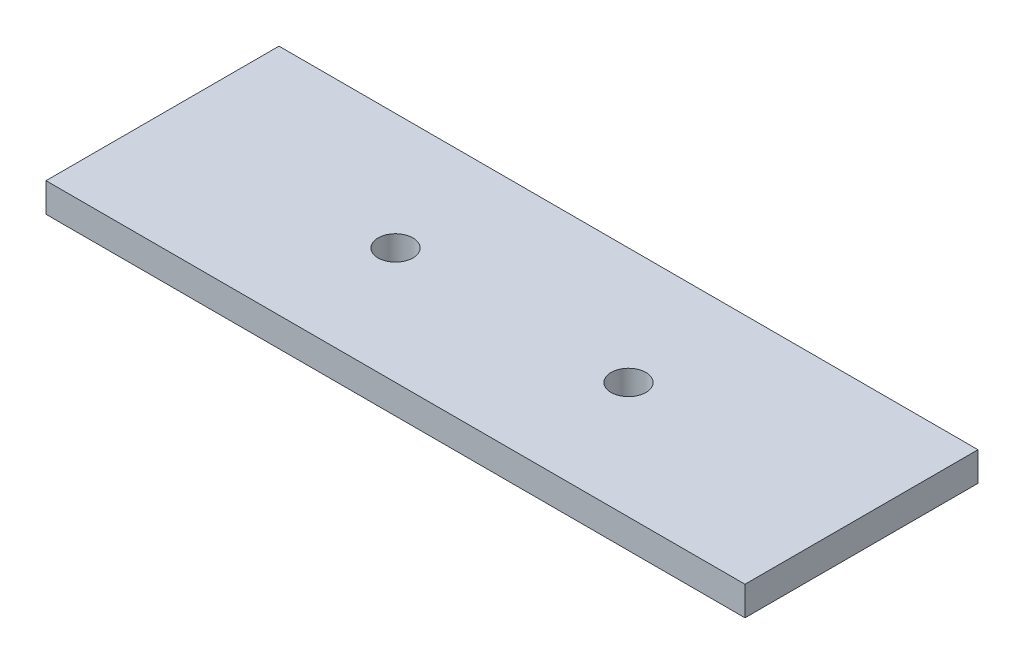
ISO-10303-21;
HEADER;
FILE_DESCRIPTION(('STEP AP214'),'2;1');
FILE_NAME('part.step','',(''),(''),'','','');
FILE_SCHEMA(('AUTOMOTIVE_DESIGN { 1 0 10303 214 1 1 1 1 }'));
ENDSEC;
DATA;
#1=APPLICATION_CONTEXT('core data for automotive mechanical design processes');
#2=APPLICATION_PROTOCOL_DEFINITION('international standard','automotive_design',2000,#1);
#3=PRODUCT_CONTEXT('',#1,'mechanical');
#4=PRODUCT('Part','Part','',(#3));
#5=PRODUCT_RELATED_PRODUCT_CATEGORY('part','',(#4));
#6=PRODUCT_DEFINITION_FORMATION('','',#4);
#7=PRODUCT_DEFINITION_CONTEXT('part definition',#1,'design');
#8=PRODUCT_DEFINITION('design','',#6,#7);
#9=PRODUCT_DEFINITION_SHAPE('','',#8);
#10=(LENGTH_UNIT() NAMED_UNIT(*) SI_UNIT(.MILLI.,.METRE.));
#11=(NAMED_UNIT(*) PLANE_ANGLE_UNIT() SI_UNIT($,.RADIAN.));
#12=(NAMED_UNIT(*) SI_UNIT($,.STERADIAN.) SOLID_ANGLE_UNIT());
#13=UNCERTAINTY_MEASURE_WITH_UNIT(LENGTH_MEASURE(1.E-05),#10,'distance_accuracy_value','');
#14=(GEOMETRIC_REPRESENTATION_CONTEXT(3) GLOBAL_UNCERTAINTY_ASSIGNED_CONTEXT((#13)) GLOBAL_UNIT_ASSIGNED_CONTEXT((#10,
#11,#12)) REPRESENTATION_CONTEXT('',''));
#15=CARTESIAN_POINT('',(0.,0.,0.));
#16=DIRECTION('',(0.,0.,1.));
#17=DIRECTION('',(1.,0.,0.));
#18=AXIS2_PLACEMENT_3D('',#15,#16,#17);
#19=CARTESIAN_POINT('',(38.1,3.175,12.7));
#20=DIRECTION('',(-1.,0.,0.));
#21=DIRECTION('',(0.,0.,1.));
#22=AXIS2_PLACEMENT_3D('',#19,#20,#21);
#23=PLANE('',#22);
#24=DIRECTION('',(0.,0.,-1.));
#25=VECTOR('',#24,1.);
#26=CARTESIAN_POINT('',(38.1,0.,12.7));
#27=LINE('',#26,#25);
#28=CARTESIAN_POINT('',(38.1,0.,12.7));
#29=VERTEX_POINT('',#28);
#30=CARTESIAN_POINT('',(38.1,0.,-12.7));
#31=VERTEX_POINT('',#30);
#32=EDGE_CURVE('E100',#29,#31,#27,.T.);
#33=ORIENTED_EDGE('',*,*,#32,.T.);
#34=DIRECTION('',(0.,-1.,0.));
#35=VECTOR('',#34,1.);
#36=CARTESIAN_POINT('',(38.1,3.175,-12.7));
#37=LINE('',#36,#35);
#38=CARTESIAN_POINT('',(38.1,3.175,-12.7));
#39=VERTEX_POINT('',#38);
#40=EDGE_CURVE('E11',#39,#31,#37,.T.);
#41=ORIENTED_EDGE('',*,*,#40,.F.);
#42=DIRECTION('',(0.,0.,-1.));
#43=VECTOR('',#42,1.);
#44=CARTESIAN_POINT('',(38.1,3.175,12.7));
#45=LINE('',#44,#43);
#46=CARTESIAN_POINT('',(38.1,3.175,12.7));
#47=VERTEX_POINT('',#46);
#48=EDGE_CURVE('E88',#47,#39,#45,.T.);
#49=ORIENTED_EDGE('',*,*,#48,.F.);
#50=DIRECTION('',(0.,-1.,0.));
#51=VECTOR('',#50,1.);
#52=CARTESIAN_POINT('',(38.1,3.175,12.7));
#53=LINE('',#52,#51);
#54=EDGE_CURVE('E96',#47,#29,#53,.T.);
#55=ORIENTED_EDGE('',*,*,#54,.T.);
#56=EDGE_LOOP('',(#33,#41,#49,#55));
#57=FACE_BOUND('',#56,.T.);
#58=ADVANCED_FACE('F37',(#57),#23,.F.);
#59=CARTESIAN_POINT('',(-38.1,3.175,-12.7));
#60=DIRECTION('',(0.,0.,1.));
#61=DIRECTION('',(1.,0.,0.));
#62=AXIS2_PLACEMENT_3D('',#59,#60,#61);
#63=PLANE('',#62);
#64=DIRECTION('',(-1.,0.,0.));
#65=VECTOR('',#64,1.);
#66=CARTESIAN_POINT('',(-38.1,0.,-12.7));
#67=LINE('',#66,#65);
#68=CARTESIAN_POINT('',(-38.1,0.,-12.7));
#69=VERTEX_POINT('',#68);
#70=EDGE_CURVE('E92',#31,#69,#67,.T.);
#71=ORIENTED_EDGE('',*,*,#70,.T.);
#72=DIRECTION('',(0.,-1.,0.));
#73=VECTOR('',#72,1.);
#74=CARTESIAN_POINT('',(-38.1,3.175,-12.7));
#75=LINE('',#74,#73);
#76=CARTESIAN_POINT('',(-38.1,3.175,-12.7));
#77=VERTEX_POINT('',#76);
#78=EDGE_CURVE('E45',#77,#69,#75,.T.);
#79=ORIENTED_EDGE('',*,*,#78,.F.);
#80=DIRECTION('',(-1.,0.,0.));
#81=VECTOR('',#80,1.);
#82=CARTESIAN_POINT('',(-38.1,3.175,-12.7));
#83=LINE('',#82,#81);
#84=EDGE_CURVE('E83',#39,#77,#83,.T.);
#85=ORIENTED_EDGE('',*,*,#84,.F.);
#86=ORIENTED_EDGE('',*,*,#40,.T.);
#87=EDGE_LOOP('',(#71,#79,#85,#86));
#88=FACE_BOUND('',#87,.T.);
#89=ADVANCED_FACE('F91',(#88),#63,.F.);
#90=CARTESIAN_POINT('',(-38.1,3.175,12.7));
#91=DIRECTION('',(1.,0.,0.));
#92=DIRECTION('',(0.,0.,-1.));
#93=AXIS2_PLACEMENT_3D('',#90,#91,#92);
#94=PLANE('',#93);
#95=DIRECTION('',(0.,0.,1.));
#96=VECTOR('',#95,1.);
#97=CARTESIAN_POINT('',(-38.1,0.,12.7));
#98=LINE('',#97,#96);
#99=CARTESIAN_POINT('',(-38.1,0.,12.7));
#100=VERTEX_POINT('',#99);
#101=EDGE_CURVE('E70',#69,#100,#98,.T.);
#102=ORIENTED_EDGE('',*,*,#101,.T.);
#103=DIRECTION('',(0.,-1.,0.));
#104=VECTOR('',#103,1.);
#105=CARTESIAN_POINT('',(-38.1,3.175,12.7));
#106=LINE('',#105,#104);
#107=CARTESIAN_POINT('',(-38.1,3.175,12.7));
#108=VERTEX_POINT('',#107);
#109=EDGE_CURVE('E93',#108,#100,#106,.T.);
#110=ORIENTED_EDGE('',*,*,#109,.F.);
#111=DIRECTION('',(0.,0.,1.));
#112=VECTOR('',#111,1.);
#113=CARTESIAN_POINT('',(-38.1,3.175,12.7));
#114=LINE('',#113,#112);
#115=EDGE_CURVE('E86',#77,#108,#114,.T.);
#116=ORIENTED_EDGE('',*,*,#115,.F.);
#117=ORIENTED_EDGE('',*,*,#78,.T.);
#118=EDGE_LOOP('',(#102,#110,#116,#117));
#119=FACE_BOUND('',#118,.T.);
#120=ADVANCED_FACE('F94',(#119),#94,.F.);
#121=CARTESIAN_POINT('',(-38.1,3.175,12.7));
#122=DIRECTION('',(0.,0.,-1.));
#123=DIRECTION('',(-1.,0.,0.));
#124=AXIS2_PLACEMENT_3D('',#121,#122,#123);
#125=PLANE('',#124);
#126=DIRECTION('',(1.,0.,0.));
#127=VECTOR('',#126,1.);
#128=CARTESIAN_POINT('',(-38.1,0.,12.7));
#129=LINE('',#128,#127);
#130=EDGE_CURVE('E76',#100,#29,#129,.T.);
#131=ORIENTED_EDGE('',*,*,#130,.T.);
#132=ORIENTED_EDGE('',*,*,#54,.F.);
#133=DIRECTION('',(1.,0.,0.));
#134=VECTOR('',#133,1.);
#135=CARTESIAN_POINT('',(-38.1,3.175,12.7));
#136=LINE('',#135,#134);
#137=EDGE_CURVE('E53',#108,#47,#136,.T.);
#138=ORIENTED_EDGE('',*,*,#137,.F.);
#139=ORIENTED_EDGE('',*,*,#109,.T.);
#140=EDGE_LOOP('',(#131,#132,#138,#139));
#141=FACE_BOUND('',#140,.T.);
#142=ADVANCED_FACE('F108',(#141),#125,.F.);
#143=CARTESIAN_POINT('',(0.,3.175,0.));
#144=DIRECTION('',(0.,-1.,0.));
#145=DIRECTION('',(0.,0.,-1.));
#146=AXIS2_PLACEMENT_3D('',#143,#144,#145);
#147=PLANE('',#146);
#148=CARTESIAN_POINT('',(-12.7,3.175,0.));
#149=DIRECTION('',(0.,1.,0.));
#150=DIRECTION('',(0.,0.,1.));
#151=AXIS2_PLACEMENT_3D('',#148,#149,#150);
#152=CIRCLE('',#151,1.89864999999999);
#153=CARTESIAN_POINT('',(-12.7,3.175,1.89864999999999));
#154=VERTEX_POINT('',#153);
#155=EDGE_CURVE('E122',#154,#154,#152,.T.);
#156=ORIENTED_EDGE('',*,*,#155,.F.);
#157=EDGE_LOOP('',(#156));
#158=FACE_BOUND('',#157,.T.);
#159=CARTESIAN_POINT('',(12.7,3.175,0.));
#160=DIRECTION('',(0.,1.,0.));
#161=DIRECTION('',(0.,0.,1.));
#162=AXIS2_PLACEMENT_3D('',#159,#160,#161);
#163=CIRCLE('',#162,1.89864999999999);
#164=CARTESIAN_POINT('',(12.7,3.175,1.89864999999999));
#165=VERTEX_POINT('',#164);
#166=EDGE_CURVE('E116',#165,#165,#163,.T.);
#167=ORIENTED_EDGE('',*,*,#166,.F.);
#168=EDGE_LOOP('',(#167));
#169=FACE_BOUND('',#168,.T.);
#170=ORIENTED_EDGE('',*,*,#48,.T.);
#171=ORIENTED_EDGE('',*,*,#84,.T.);
#172=ORIENTED_EDGE('',*,*,#115,.T.);
#173=ORIENTED_EDGE('',*,*,#137,.T.);
#174=EDGE_LOOP('',(#170,#171,#172,#173));
#175=FACE_BOUND('',#174,.T.);
#176=ADVANCED_FACE('F84',(#158,#169,#175),#147,.F.);
#177=CARTESIAN_POINT('',(0.,0.,0.));
#178=DIRECTION('',(0.,-1.,0.));
#179=DIRECTION('',(0.,0.,-1.));
#180=AXIS2_PLACEMENT_3D('',#177,#178,#179);
#181=PLANE('',#180);
#182=CARTESIAN_POINT('',(-12.7,0.,0.));
#183=DIRECTION('',(0.,1.,0.));
#184=DIRECTION('',(0.,0.,1.));
#185=AXIS2_PLACEMENT_3D('',#182,#183,#184);
#186=CIRCLE('',#185,1.89865);
#187=CARTESIAN_POINT('',(-12.7,0.,1.89865));
#188=VERTEX_POINT('',#187);
#189=EDGE_CURVE('E119',#188,#188,#186,.T.);
#190=ORIENTED_EDGE('',*,*,#189,.T.);
#191=EDGE_LOOP('',(#190));
#192=FACE_BOUND('',#191,.T.);
#193=CARTESIAN_POINT('',(12.7,0.,0.));
#194=DIRECTION('',(0.,1.,0.));
#195=DIRECTION('',(0.,0.,1.));
#196=AXIS2_PLACEMENT_3D('',#193,#194,#195);
#197=CIRCLE('',#196,1.89865);
#198=CARTESIAN_POINT('',(12.7,0.,1.89865));
#199=VERTEX_POINT('',#198);
#200=EDGE_CURVE('E103',#199,#199,#197,.T.);
#201=ORIENTED_EDGE('',*,*,#200,.T.);
#202=EDGE_LOOP('',(#201));
#203=FACE_BOUND('',#202,.T.);
#204=ORIENTED_EDGE('',*,*,#32,.F.);
#205=ORIENTED_EDGE('',*,*,#130,.F.);
#206=ORIENTED_EDGE('',*,*,#101,.F.);
#207=ORIENTED_EDGE('',*,*,#70,.F.);
#208=EDGE_LOOP('',(#204,#205,#206,#207));
#209=FACE_BOUND('',#208,.T.);
#210=ADVANCED_FACE('F111',(#192,#203,#209),#181,.T.);
#211=CARTESIAN_POINT('',(12.7,3.175,0.));
#212=DIRECTION('',(0.,1.,0.));
#213=DIRECTION('',(0.,0.,1.));
#214=AXIS2_PLACEMENT_3D('',#211,#212,#213);
#215=CYLINDRICAL_SURFACE('',#214,1.89864999999999);
#216=ORIENTED_EDGE('',*,*,#200,.F.);
#217=EDGE_LOOP('',(#216));
#218=FACE_BOUND('',#217,.T.);
#219=ORIENTED_EDGE('',*,*,#166,.T.);
#220=EDGE_LOOP('',(#219));
#221=FACE_BOUND('',#220,.T.);
#222=ADVANCED_FACE('F133',(#218,#221),#215,.F.);
#223=CARTESIAN_POINT('',(-12.7,3.175,0.));
#224=DIRECTION('',(0.,1.,0.));
#225=DIRECTION('',(0.,0.,1.));
#226=AXIS2_PLACEMENT_3D('',#223,#224,#225);
#227=CYLINDRICAL_SURFACE('',#226,1.89864999999999);
#228=ORIENTED_EDGE('',*,*,#189,.F.);
#229=EDGE_LOOP('',(#228));
#230=FACE_BOUND('',#229,.T.);
#231=ORIENTED_EDGE('',*,*,#155,.T.);
#232=EDGE_LOOP('',(#231));
#233=FACE_BOUND('',#232,.T.);
#234=ADVANCED_FACE('F126',(#230,#233),#227,.F.);
#235=CLOSED_SHELL('',(#58,#89,#120,#142,#176,#210,#222,#234));
#236=MANIFOLD_SOLID_BREP('B2',#235);
#237=ADVANCED_BREP_SHAPE_REPRESENTATION('',(#18,#236),#14);
#238=SHAPE_DEFINITION_REPRESENTATION(#9,#237);
ENDSEC;
END-ISO-10303-21;
